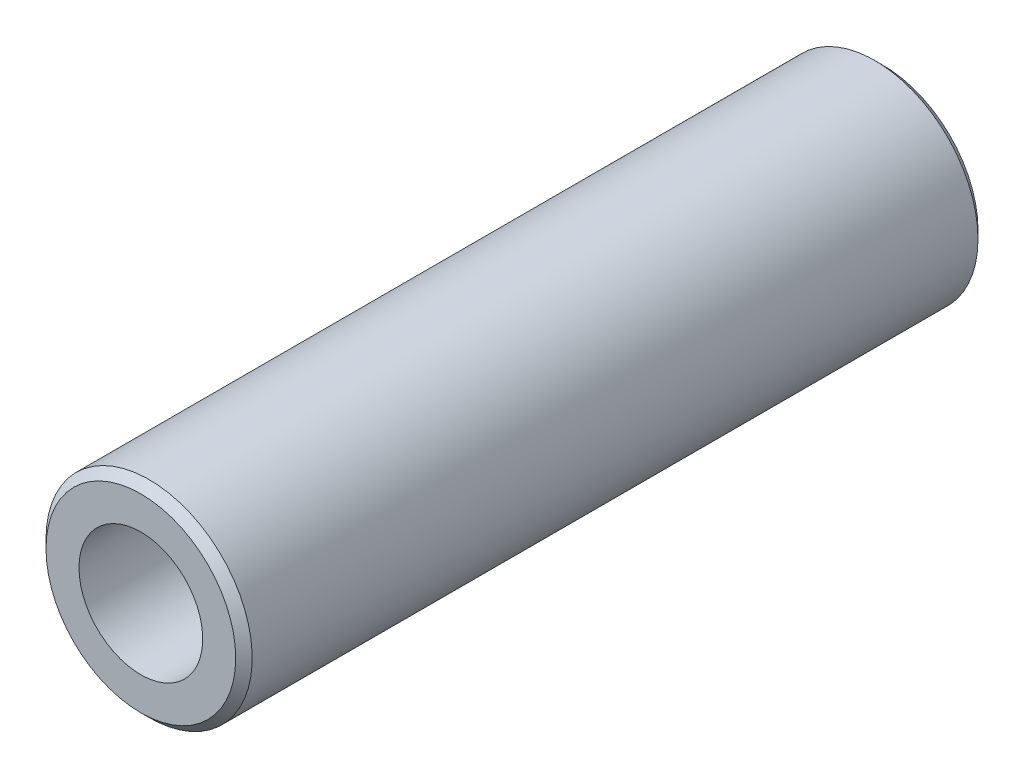
ISO-10303-21;
HEADER;
FILE_DESCRIPTION(('STEP AP214'),'2;1');
FILE_NAME('part.step','',(''),(''),'','','');
FILE_SCHEMA(('AUTOMOTIVE_DESIGN { 1 0 10303 214 1 1 1 1 }'));
ENDSEC;
DATA;
#1=APPLICATION_CONTEXT('core data for automotive mechanical design processes');
#2=APPLICATION_PROTOCOL_DEFINITION('international standard','automotive_design',2000,#1);
#3=PRODUCT_CONTEXT('',#1,'mechanical');
#4=PRODUCT('Part','Part','',(#3));
#5=PRODUCT_RELATED_PRODUCT_CATEGORY('part','',(#4));
#6=PRODUCT_DEFINITION_FORMATION('','',#4);
#7=PRODUCT_DEFINITION_CONTEXT('part definition',#1,'design');
#8=PRODUCT_DEFINITION('design','',#6,#7);
#9=PRODUCT_DEFINITION_SHAPE('','',#8);
#10=(LENGTH_UNIT() NAMED_UNIT(*) SI_UNIT(.MILLI.,.METRE.));
#11=(NAMED_UNIT(*) PLANE_ANGLE_UNIT() SI_UNIT($,.RADIAN.));
#12=(NAMED_UNIT(*) SI_UNIT($,.STERADIAN.) SOLID_ANGLE_UNIT());
#13=UNCERTAINTY_MEASURE_WITH_UNIT(LENGTH_MEASURE(1.E-05),#10,'distance_accuracy_value','');
#14=(GEOMETRIC_REPRESENTATION_CONTEXT(3) GLOBAL_UNCERTAINTY_ASSIGNED_CONTEXT((#13)) GLOBAL_UNIT_ASSIGNED_CONTEXT((#10,
#11,#12)) REPRESENTATION_CONTEXT('',''));
#15=CARTESIAN_POINT('',(0.,0.,0.));
#16=DIRECTION('',(0.,0.,1.));
#17=DIRECTION('',(1.,0.,0.));
#18=AXIS2_PLACEMENT_3D('',#15,#16,#17);
#19=CARTESIAN_POINT('',(0.,0.,22.5));
#20=DIRECTION('',(0.,0.,1.));
#21=DIRECTION('',(1.,0.,0.));
#22=AXIS2_PLACEMENT_3D('',#19,#20,#21);
#23=PLANE('',#22);
#24=CARTESIAN_POINT('',(0.,0.,22.5));
#25=DIRECTION('',(0.,0.,1.));
#26=DIRECTION('',(1.,0.,0.));
#27=AXIS2_PLACEMENT_3D('',#24,#25,#26);
#28=CIRCLE('',#27,5.75000000000002);
#29=CARTESIAN_POINT('',(5.75000000000002,0.,22.5));
#30=VERTEX_POINT('',#29);
#31=EDGE_CURVE('E11',#30,#30,#28,.T.);
#32=ORIENTED_EDGE('',*,*,#31,.T.);
#33=EDGE_LOOP('',(#32));
#34=FACE_BOUND('',#33,.T.);
#35=CARTESIAN_POINT('',(0.,0.,22.5));
#36=DIRECTION('',(0.,0.,1.));
#37=DIRECTION('',(1.,0.,0.));
#38=AXIS2_PLACEMENT_3D('',#35,#36,#37);
#39=CIRCLE('',#38,3.75);
#40=CARTESIAN_POINT('',(-3.75,0.,22.5));
#41=VERTEX_POINT('',#40);
#42=EDGE_CURVE('E60',#41,#41,#39,.T.);
#43=ORIENTED_EDGE('',*,*,#42,.F.);
#44=EDGE_LOOP('',(#43));
#45=FACE_BOUND('',#44,.T.);
#46=ADVANCED_FACE('F39',(#34,#45),#23,.T.);
#47=CARTESIAN_POINT('',(0.,0.,-22.5));
#48=DIRECTION('',(0.,0.,1.));
#49=DIRECTION('',(1.,0.,0.));
#50=AXIS2_PLACEMENT_3D('',#47,#48,#49);
#51=PLANE('',#50);
#52=CARTESIAN_POINT('',(0.,0.,-22.5));
#53=DIRECTION('',(0.,0.,1.));
#54=DIRECTION('',(1.,0.,0.));
#55=AXIS2_PLACEMENT_3D('',#52,#53,#54);
#56=CIRCLE('',#55,5.74999999999996);
#57=CARTESIAN_POINT('',(5.74999999999996,0.,-22.5));
#58=VERTEX_POINT('',#57);
#59=EDGE_CURVE('E47',#58,#58,#56,.F.);
#60=ORIENTED_EDGE('',*,*,#59,.T.);
#61=EDGE_LOOP('',(#60));
#62=FACE_BOUND('',#61,.T.);
#63=CARTESIAN_POINT('',(0.,0.,-22.5));
#64=DIRECTION('',(0.,0.,1.));
#65=DIRECTION('',(1.,0.,0.));
#66=AXIS2_PLACEMENT_3D('',#63,#64,#65);
#67=CIRCLE('',#66,3.75);
#68=CARTESIAN_POINT('',(-3.75,0.,-22.5));
#69=VERTEX_POINT('',#68);
#70=EDGE_CURVE('E61',#69,#69,#67,.T.);
#71=ORIENTED_EDGE('',*,*,#70,.T.);
#72=EDGE_LOOP('',(#71));
#73=FACE_BOUND('',#72,.T.);
#74=ADVANCED_FACE('F71',(#62,#73),#51,.F.);
#75=CARTESIAN_POINT('',(0.,0.,22.5));
#76=DIRECTION('',(0.,0.,-1.));
#77=DIRECTION('',(-1.,0.,0.));
#78=AXIS2_PLACEMENT_3D('',#75,#76,#77);
#79=CYLINDRICAL_SURFACE('',#78,6.25);
#80=CARTESIAN_POINT('',(0.,0.,-22.));
#81=DIRECTION('',(0.,0.,1.));
#82=DIRECTION('',(1.,0.,0.));
#83=AXIS2_PLACEMENT_3D('',#80,#81,#82);
#84=CIRCLE('',#83,6.25);
#85=CARTESIAN_POINT('',(-6.25,0.,-22.));
#86=VERTEX_POINT('',#85);
#87=EDGE_CURVE('E51',#86,#86,#84,.T.);
#88=CARTESIAN_POINT('',(0.,0.,22.));
#89=DIRECTION('',(0.,0.,1.));
#90=DIRECTION('',(1.,0.,0.));
#91=AXIS2_PLACEMENT_3D('',#88,#89,#90);
#92=CIRCLE('',#91,6.25);
#93=CARTESIAN_POINT('',(-6.25,0.,22.));
#94=VERTEX_POINT('',#93);
#95=EDGE_CURVE('E55',#94,#94,#92,.F.);
#96=CARTESIAN_POINT('',(-6.25,0.,-22.));
#97=CARTESIAN_POINT('',(-6.25,0.,-21.5416666666666));
#98=CARTESIAN_POINT('',(-6.25,0.,-21.0833333333333));
#99=CARTESIAN_POINT('',(-6.25,0.,-20.1666666666666));
#100=CARTESIAN_POINT('',(-6.25,0.,-19.7083333333333));
#101=CARTESIAN_POINT('',(-6.25,0.,-18.7916666666666));
#102=CARTESIAN_POINT('',(-6.25,0.,-18.3333333333333));
#103=CARTESIAN_POINT('',(-6.25,0.,-17.4166666666666));
#104=CARTESIAN_POINT('',(-6.25,0.,-16.9583333333333));
#105=CARTESIAN_POINT('',(-6.25,0.,-16.0416666666666));
#106=CARTESIAN_POINT('',(-6.25,0.,-15.5833333333333));
#107=CARTESIAN_POINT('',(-6.25,0.,-14.6666666666666));
#108=CARTESIAN_POINT('',(-6.25,0.,-14.2083333333333));
#109=CARTESIAN_POINT('',(-6.25,0.,-13.2916666666666));
#110=CARTESIAN_POINT('',(-6.25,0.,-12.8333333333333));
#111=CARTESIAN_POINT('',(-6.25,0.,-11.9166666666666));
#112=CARTESIAN_POINT('',(-6.25,0.,-11.4583333333333));
#113=CARTESIAN_POINT('',(-6.25,0.,-10.5416666666666));
#114=CARTESIAN_POINT('',(-6.25,0.,-10.0833333333333));
#115=CARTESIAN_POINT('',(-6.25,0.,-9.16666666666663));
#116=CARTESIAN_POINT('',(-6.25,0.,-8.7083333333333));
#117=CARTESIAN_POINT('',(-6.25,0.,-7.79166666666664));
#118=CARTESIAN_POINT('',(-6.25,0.,-7.3333333333333));
#119=CARTESIAN_POINT('',(-6.25,0.,-6.41666666666664));
#120=CARTESIAN_POINT('',(-6.25,0.,-5.9583333333333));
#121=CARTESIAN_POINT('',(-6.25,0.,-5.04166666666664));
#122=CARTESIAN_POINT('',(-6.25,0.,-4.5833333333333));
#123=CARTESIAN_POINT('',(-6.25,0.,-3.66666666666664));
#124=CARTESIAN_POINT('',(-6.25,0.,-3.2083333333333));
#125=CARTESIAN_POINT('',(-6.25,0.,-2.29166666666664));
#126=CARTESIAN_POINT('',(-6.25,0.,-1.83333333333331));
#127=CARTESIAN_POINT('',(-6.25,0.,-0.91666666666664));
#128=CARTESIAN_POINT('',(-6.25,0.,-0.458333333333306));
#129=CARTESIAN_POINT('',(-6.25,0.,0.458333333333361));
#130=CARTESIAN_POINT('',(-6.25,0.,0.916666666666695));
#131=CARTESIAN_POINT('',(-6.25,0.,1.83333333333336));
#132=CARTESIAN_POINT('',(-6.25,0.,2.29166666666669));
#133=CARTESIAN_POINT('',(-6.25,0.,3.20833333333336));
#134=CARTESIAN_POINT('',(-6.25,0.,3.66666666666669));
#135=CARTESIAN_POINT('',(-6.25,0.,4.58333333333336));
#136=CARTESIAN_POINT('',(-6.25,0.,5.04166666666669));
#137=CARTESIAN_POINT('',(-6.25,0.,5.95833333333336));
#138=CARTESIAN_POINT('',(-6.25,0.,6.41666666666669));
#139=CARTESIAN_POINT('',(-6.25,0.,7.33333333333336));
#140=CARTESIAN_POINT('',(-6.25,0.,7.79166666666669));
#141=CARTESIAN_POINT('',(-6.25,0.,8.70833333333336));
#142=CARTESIAN_POINT('',(-6.25,0.,9.16666666666669));
#143=CARTESIAN_POINT('',(-6.25,0.,10.0833333333334));
#144=CARTESIAN_POINT('',(-6.25,0.,10.5416666666667));
#145=CARTESIAN_POINT('',(-6.25,0.,11.4583333333334));
#146=CARTESIAN_POINT('',(-6.25,0.,11.9166666666667));
#147=CARTESIAN_POINT('',(-6.25,0.,12.8333333333334));
#148=CARTESIAN_POINT('',(-6.25,0.,13.2916666666667));
#149=CARTESIAN_POINT('',(-6.25,0.,14.2083333333334));
#150=CARTESIAN_POINT('',(-6.25,0.,14.6666666666667));
#151=CARTESIAN_POINT('',(-6.25,0.,15.5833333333334));
#152=CARTESIAN_POINT('',(-6.25,0.,16.0416666666667));
#153=CARTESIAN_POINT('',(-6.25,0.,16.9583333333334));
#154=CARTESIAN_POINT('',(-6.25,0.,17.4166666666667));
#155=CARTESIAN_POINT('',(-6.25,0.,18.3333333333334));
#156=CARTESIAN_POINT('',(-6.25,0.,18.7916666666667));
#157=CARTESIAN_POINT('',(-6.25,0.,19.7083333333334));
#158=CARTESIAN_POINT('',(-6.25,0.,20.1666666666667));
#159=CARTESIAN_POINT('',(-6.25,0.,21.0833333333334));
#160=CARTESIAN_POINT('',(-6.25,0.,21.5416666666667));
#161=CARTESIAN_POINT('',(-6.25,0.,22.));
#162=B_SPLINE_CURVE_WITH_KNOTS('',3,(#96,#97,#98,#99,#100,#101,#102,#103,#104,#105,#106,#107,
#108,#109,#110,#111,#112,#113,#114,#115,#116,#117,#118,#119,#120,#121,#122,#123,#124,#125,#126,
#127,#128,#129,#130,#131,#132,#133,#134,#135,#136,#137,#138,#139,#140,#141,#142,#143,#144,#145,
#146,#147,#148,#149,#150,#151,#152,#153,#154,#155,#156,#157,#158,#159,#160,#161),.UNSPECIFIED.,
.F.,.F.,(4,2,2,2,2,2,2,2,2,2,2,2,2,2,2,2,2,2,2,2,2,2,2,2,2,2,2,2,2,2,2,2,4),(0.,1.375,2.75,
4.125,5.5,6.875,8.25,9.62499999999999,11.,12.375,13.75,15.125,16.5,17.875,19.25,20.625,22.,
23.375,24.75,26.125,27.5,28.875,30.25,31.625,33.,34.375,35.75,37.125,38.5,39.875,41.25,42.625,
44.),.UNSPECIFIED.);
#163=EDGE_CURVE('BSEAM76',#86,#94,#162,.T.);
#164=ORIENTED_EDGE('',*,*,#87,.T.);
#165=ORIENTED_EDGE('',*,*,#95,.T.);
#166=ORIENTED_EDGE('',*,*,#163,.T.);
#167=ORIENTED_EDGE('',*,*,#163,.F.);
#168=EDGE_LOOP('',(#164,#166,#165,#167));
#169=FACE_BOUND('',#168,.T.);
#170=ADVANCED_FACE('F76',(#169),#79,.T.);
#171=CARTESIAN_POINT('',(0.,0.,22.5));
#172=DIRECTION('',(0.,0.,-1.));
#173=DIRECTION('',(-1.,0.,0.));
#174=AXIS2_PLACEMENT_3D('',#171,#172,#173);
#175=CYLINDRICAL_SURFACE('',#174,3.75);
#176=CARTESIAN_POINT('',(-3.75,0.,22.5));
#177=CARTESIAN_POINT('',(-3.75,0.,22.03125));
#178=CARTESIAN_POINT('',(-3.75,0.,21.5625));
#179=CARTESIAN_POINT('',(-3.75,0.,20.625));
#180=CARTESIAN_POINT('',(-3.75,0.,20.15625));
#181=CARTESIAN_POINT('',(-3.75,0.,19.21875));
#182=CARTESIAN_POINT('',(-3.75,0.,18.75));
#183=CARTESIAN_POINT('',(-3.75,0.,17.8125));
#184=CARTESIAN_POINT('',(-3.75,0.,17.34375));
#185=CARTESIAN_POINT('',(-3.75,0.,16.40625));
#186=CARTESIAN_POINT('',(-3.75,0.,15.9375));
#187=CARTESIAN_POINT('',(-3.75,0.,15.));
#188=CARTESIAN_POINT('',(-3.75,0.,14.53125));
#189=CARTESIAN_POINT('',(-3.75,0.,13.59375));
#190=CARTESIAN_POINT('',(-3.75,0.,13.125));
#191=CARTESIAN_POINT('',(-3.75,0.,12.1875));
#192=CARTESIAN_POINT('',(-3.75,0.,11.71875));
#193=CARTESIAN_POINT('',(-3.75,0.,10.78125));
#194=CARTESIAN_POINT('',(-3.75,0.,10.3125));
#195=CARTESIAN_POINT('',(-3.75,0.,9.37499999999999));
#196=CARTESIAN_POINT('',(-3.75,0.,8.90625));
#197=CARTESIAN_POINT('',(-3.75,0.,7.96874999999999));
#198=CARTESIAN_POINT('',(-3.75,0.,7.5));
#199=CARTESIAN_POINT('',(-3.75,0.,6.5625));
#200=CARTESIAN_POINT('',(-3.75,0.,6.09375));
#201=CARTESIAN_POINT('',(-3.75,0.,5.15625));
#202=CARTESIAN_POINT('',(-3.75,0.,4.6875));
#203=CARTESIAN_POINT('',(-3.75,0.,3.75));
#204=CARTESIAN_POINT('',(-3.75,0.,3.28125));
#205=CARTESIAN_POINT('',(-3.75,0.,2.34375));
#206=CARTESIAN_POINT('',(-3.75,0.,1.875));
#207=CARTESIAN_POINT('',(-3.75,0.,0.937499999999997));
#208=CARTESIAN_POINT('',(-3.75,0.,0.468749999999997));
#209=CARTESIAN_POINT('',(-3.75,0.,-0.468750000000004));
#210=CARTESIAN_POINT('',(-3.75,0.,-0.937500000000004));
#211=CARTESIAN_POINT('',(-3.75,0.,-1.87500000000001));
#212=CARTESIAN_POINT('',(-3.75,0.,-2.34375000000001));
#213=CARTESIAN_POINT('',(-3.75,0.,-3.28125));
#214=CARTESIAN_POINT('',(-3.75,0.,-3.75));
#215=CARTESIAN_POINT('',(-3.75,0.,-4.6875));
#216=CARTESIAN_POINT('',(-3.75,0.,-5.15625));
#217=CARTESIAN_POINT('',(-3.75,0.,-6.09375000000001));
#218=CARTESIAN_POINT('',(-3.75,0.,-6.56250000000001));
#219=CARTESIAN_POINT('',(-3.75,0.,-7.50000000000001));
#220=CARTESIAN_POINT('',(-3.75,0.,-7.96875000000001));
#221=CARTESIAN_POINT('',(-3.75,0.,-8.90625));
#222=CARTESIAN_POINT('',(-3.75,0.,-9.37500000000001));
#223=CARTESIAN_POINT('',(-3.75,0.,-10.3125));
#224=CARTESIAN_POINT('',(-3.75,0.,-10.78125));
#225=CARTESIAN_POINT('',(-3.75,0.,-11.71875));
#226=CARTESIAN_POINT('',(-3.75,0.,-12.1875));
#227=CARTESIAN_POINT('',(-3.75,0.,-13.125));
#228=CARTESIAN_POINT('',(-3.75,0.,-13.59375));
#229=CARTESIAN_POINT('',(-3.75,0.,-14.53125));
#230=CARTESIAN_POINT('',(-3.75,0.,-15.));
#231=CARTESIAN_POINT('',(-3.75,0.,-15.9375));
#232=CARTESIAN_POINT('',(-3.75,0.,-16.40625));
#233=CARTESIAN_POINT('',(-3.75,0.,-17.34375));
#234=CARTESIAN_POINT('',(-3.75,0.,-17.8125));
#235=CARTESIAN_POINT('',(-3.75,0.,-18.75));
#236=CARTESIAN_POINT('',(-3.75,0.,-19.21875));
#237=CARTESIAN_POINT('',(-3.75,0.,-20.15625));
#238=CARTESIAN_POINT('',(-3.75,0.,-20.625));
#239=CARTESIAN_POINT('',(-3.75,0.,-21.5625));
#240=CARTESIAN_POINT('',(-3.75,0.,-22.03125));
#241=CARTESIAN_POINT('',(-3.75,0.,-22.5));
#242=B_SPLINE_CURVE_WITH_KNOTS('',3,(#176,#177,#178,#179,#180,#181,#182,#183,#184,#185,#186,
#187,#188,#189,#190,#191,#192,#193,#194,#195,#196,#197,#198,#199,#200,#201,#202,#203,#204,#205,
#206,#207,#208,#209,#210,#211,#212,#213,#214,#215,#216,#217,#218,#219,#220,#221,#222,#223,#224,
#225,#226,#227,#228,#229,#230,#231,#232,#233,#234,#235,#236,#237,#238,#239,#240,#241),
.UNSPECIFIED.,.F.,.F.,(4,2,2,2,2,2,2,2,2,2,2,2,2,2,2,2,2,2,2,2,2,2,2,2,2,2,2,2,2,2,2,2,4),(0.,
1.40625,2.8125,4.21875,5.625,7.03125,8.4375,9.84375,11.25,12.65625,14.0625,15.46875,16.875,
18.28125,19.6875,21.09375,22.5,23.90625,25.3125,26.71875,28.125,29.53125,30.9375,32.34375,33.75,
35.15625,36.5625,37.96875,39.375,40.78125,42.1875,43.59375,45.),.UNSPECIFIED.);
#243=EDGE_CURVE('BSEAM67',#41,#69,#242,.T.);
#244=ORIENTED_EDGE('',*,*,#42,.T.);
#245=ORIENTED_EDGE('',*,*,#70,.F.);
#246=ORIENTED_EDGE('',*,*,#243,.T.);
#247=ORIENTED_EDGE('',*,*,#243,.F.);
#248=EDGE_LOOP('',(#244,#246,#245,#247));
#249=FACE_BOUND('',#248,.T.);
#250=ADVANCED_FACE('F67',(#249),#175,.F.);
#251=CARTESIAN_POINT('',(0.,0.,-22.));
#252=DIRECTION('',(0.,0.,1.));
#253=DIRECTION('',(1.,0.,0.));
#254=AXIS2_PLACEMENT_3D('',#251,#252,#253);
#255=CONICAL_SURFACE('',#254,6.25,0.785398163397454);
#256=ORIENTED_EDGE('',*,*,#59,.F.);
#257=EDGE_LOOP('',(#256));
#258=FACE_BOUND('',#257,.T.);
#259=ORIENTED_EDGE('',*,*,#87,.F.);
#260=EDGE_LOOP('',(#259));
#261=FACE_BOUND('',#260,.T.);
#262=ADVANCED_FACE('F83',(#258,#261),#255,.T.);
#263=CARTESIAN_POINT('',(0.,0.,22.5));
#264=DIRECTION('',(0.,0.,-1.));
#265=DIRECTION('',(-1.,0.,0.));
#266=AXIS2_PLACEMENT_3D('',#263,#264,#265);
#267=CONICAL_SURFACE('',#266,5.75000000000002,0.785398163397448);
#268=ORIENTED_EDGE('',*,*,#95,.F.);
#269=EDGE_LOOP('',(#268));
#270=FACE_BOUND('',#269,.T.);
#271=ORIENTED_EDGE('',*,*,#31,.F.);
#272=EDGE_LOOP('',(#271));
#273=FACE_BOUND('',#272,.T.);
#274=ADVANCED_FACE('F42',(#270,#273),#267,.T.);
#275=CLOSED_SHELL('',(#46,#74,#170,#250,#262,#274));
#276=MANIFOLD_SOLID_BREP('B2',#275);
#277=ADVANCED_BREP_SHAPE_REPRESENTATION('',(#18,#276),#14);
#278=SHAPE_DEFINITION_REPRESENTATION(#9,#277);
ENDSEC;
END-ISO-10303-21;
